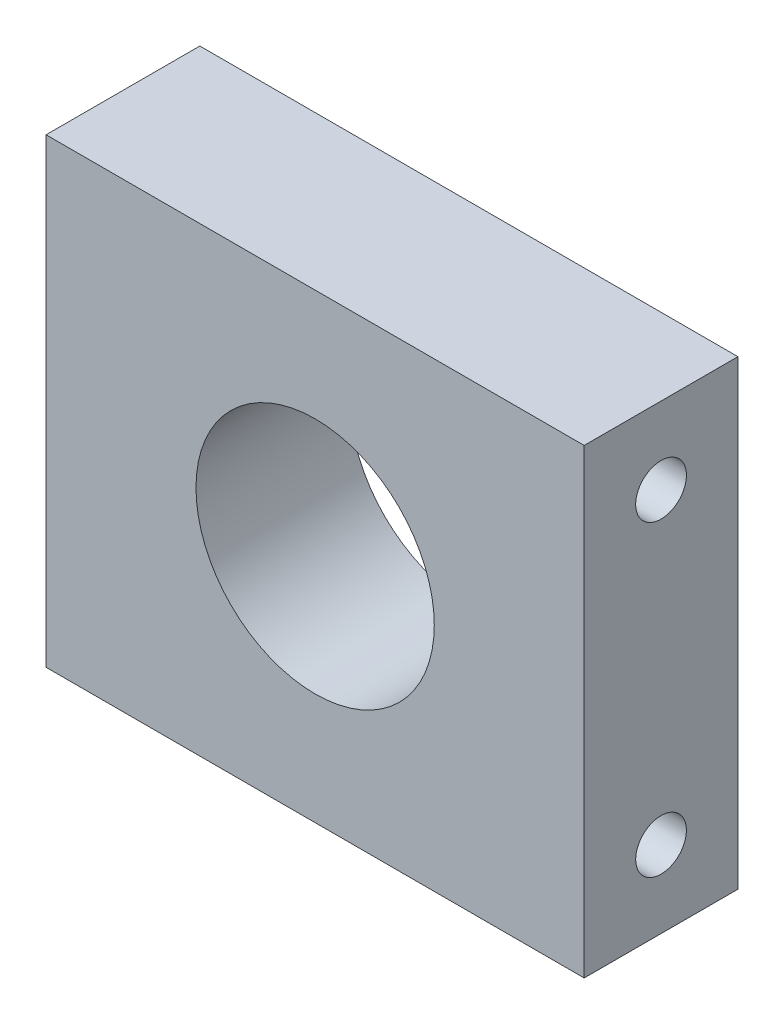
ISO-10303-21;
HEADER;
FILE_DESCRIPTION(('STEP AP214'),'2;1');
FILE_NAME('part.step','',(''),(''),'','','');
FILE_SCHEMA(('AUTOMOTIVE_DESIGN { 1 0 10303 214 1 1 1 1 }'));
ENDSEC;
DATA;
#1=APPLICATION_CONTEXT('core data for automotive mechanical design processes');
#2=APPLICATION_PROTOCOL_DEFINITION('international standard','automotive_design',2000,#1);
#3=PRODUCT_CONTEXT('',#1,'mechanical');
#4=PRODUCT('Part','Part','',(#3));
#5=PRODUCT_RELATED_PRODUCT_CATEGORY('part','',(#4));
#6=PRODUCT_DEFINITION_FORMATION('','',#4);
#7=PRODUCT_DEFINITION_CONTEXT('part definition',#1,'design');
#8=PRODUCT_DEFINITION('design','',#6,#7);
#9=PRODUCT_DEFINITION_SHAPE('','',#8);
#10=(LENGTH_UNIT() NAMED_UNIT(*) SI_UNIT(.MILLI.,.METRE.));
#11=(NAMED_UNIT(*) PLANE_ANGLE_UNIT() SI_UNIT($,.RADIAN.));
#12=(NAMED_UNIT(*) SI_UNIT($,.STERADIAN.) SOLID_ANGLE_UNIT());
#13=UNCERTAINTY_MEASURE_WITH_UNIT(LENGTH_MEASURE(1.E-05),#10,'distance_accuracy_value','');
#14=(GEOMETRIC_REPRESENTATION_CONTEXT(3) GLOBAL_UNCERTAINTY_ASSIGNED_CONTEXT((#13)) GLOBAL_UNIT_ASSIGNED_CONTEXT((#10,
#11,#12)) REPRESENTATION_CONTEXT('',''));
#15=CARTESIAN_POINT('',(0.,0.,0.));
#16=DIRECTION('',(0.,0.,1.));
#17=DIRECTION('',(1.,0.,0.));
#18=AXIS2_PLACEMENT_3D('',#15,#16,#17);
#19=CARTESIAN_POINT('',(-17.5,-15.,10.));
#20=DIRECTION('',(1.,0.,0.));
#21=DIRECTION('',(0.,0.,-1.));
#22=AXIS2_PLACEMENT_3D('',#19,#20,#21);
#23=PLANE('',#22);
#24=CARTESIAN_POINT('',(-17.5,10.,5.));
#25=DIRECTION('',(1.,0.,0.));
#26=DIRECTION('',(0.,0.,-1.));
#27=AXIS2_PLACEMENT_3D('',#24,#25,#26);
#28=CIRCLE('',#27,1.65);
#29=CARTESIAN_POINT('',(-17.5,10.,3.35));
#30=VERTEX_POINT('',#29);
#31=EDGE_CURVE('E128',#30,#30,#28,.T.);
#32=ORIENTED_EDGE('',*,*,#31,.T.);
#33=EDGE_LOOP('',(#32));
#34=FACE_BOUND('',#33,.T.);
#35=DIRECTION('',(0.,-1.,0.));
#36=VECTOR('',#35,1.);
#37=CARTESIAN_POINT('',(-17.5,-15.,0.));
#38=LINE('',#37,#36);
#39=CARTESIAN_POINT('',(-17.5,15.,0.));
#40=VERTEX_POINT('',#39);
#41=CARTESIAN_POINT('',(-17.5,-15.,0.));
#42=VERTEX_POINT('',#41);
#43=EDGE_CURVE('E95',#40,#42,#38,.T.);
#44=ORIENTED_EDGE('',*,*,#43,.T.);
#45=DIRECTION('',(0.,0.,-1.));
#46=VECTOR('',#45,1.);
#47=CARTESIAN_POINT('',(-17.5,-15.,10.));
#48=LINE('',#47,#46);
#49=CARTESIAN_POINT('',(-17.5,-15.,10.));
#50=VERTEX_POINT('',#49);
#51=EDGE_CURVE('E11',#50,#42,#48,.T.);
#52=ORIENTED_EDGE('',*,*,#51,.F.);
#53=DIRECTION('',(0.,-1.,0.));
#54=VECTOR('',#53,1.);
#55=CARTESIAN_POINT('',(-17.5,-15.,10.));
#56=LINE('',#55,#54);
#57=CARTESIAN_POINT('',(-17.5,15.,10.));
#58=VERTEX_POINT('',#57);
#59=EDGE_CURVE('E83',#58,#50,#56,.T.);
#60=ORIENTED_EDGE('',*,*,#59,.F.);
#61=DIRECTION('',(0.,0.,-1.));
#62=VECTOR('',#61,1.);
#63=CARTESIAN_POINT('',(-17.5,15.,10.));
#64=LINE('',#63,#62);
#65=EDGE_CURVE('E91',#58,#40,#64,.T.);
#66=ORIENTED_EDGE('',*,*,#65,.T.);
#67=EDGE_LOOP('',(#44,#52,#60,#66));
#68=FACE_BOUND('',#67,.T.);
#69=CARTESIAN_POINT('',(-17.5,-10.,5.));
#70=DIRECTION('',(1.,0.,0.));
#71=DIRECTION('',(0.,0.,1.));
#72=AXIS2_PLACEMENT_3D('',#69,#70,#71);
#73=CIRCLE('',#72,1.65);
#74=CARTESIAN_POINT('',(-17.5,-10.,6.65));
#75=VERTEX_POINT('',#74);
#76=EDGE_CURVE('E134',#75,#75,#73,.T.);
#77=ORIENTED_EDGE('',*,*,#76,.T.);
#78=EDGE_LOOP('',(#77));
#79=FACE_BOUND('',#78,.T.);
#80=ADVANCED_FACE('F32',(#34,#68,#79),#23,.F.);
#81=CARTESIAN_POINT('',(17.5,-15.,10.));
#82=DIRECTION('',(0.,1.,0.));
#83=DIRECTION('',(-1.,0.,0.));
#84=AXIS2_PLACEMENT_3D('',#81,#82,#83);
#85=PLANE('',#84);
#86=DIRECTION('',(1.,0.,0.));
#87=VECTOR('',#86,1.);
#88=CARTESIAN_POINT('',(17.5,-15.,0.));
#89=LINE('',#88,#87);
#90=CARTESIAN_POINT('',(17.5,-15.,0.));
#91=VERTEX_POINT('',#90);
#92=EDGE_CURVE('E87',#42,#91,#89,.T.);
#93=ORIENTED_EDGE('',*,*,#92,.T.);
#94=DIRECTION('',(0.,0.,-1.));
#95=VECTOR('',#94,1.);
#96=CARTESIAN_POINT('',(17.5,-15.,10.));
#97=LINE('',#96,#95);
#98=CARTESIAN_POINT('',(17.5,-15.,10.));
#99=VERTEX_POINT('',#98);
#100=EDGE_CURVE('E40',#99,#91,#97,.T.);
#101=ORIENTED_EDGE('',*,*,#100,.F.);
#102=DIRECTION('',(1.,0.,0.));
#103=VECTOR('',#102,1.);
#104=CARTESIAN_POINT('',(17.5,-15.,10.));
#105=LINE('',#104,#103);
#106=EDGE_CURVE('E78',#50,#99,#105,.T.);
#107=ORIENTED_EDGE('',*,*,#106,.F.);
#108=ORIENTED_EDGE('',*,*,#51,.T.);
#109=EDGE_LOOP('',(#93,#101,#107,#108));
#110=FACE_BOUND('',#109,.T.);
#111=ADVANCED_FACE('F86',(#110),#85,.F.);
#112=CARTESIAN_POINT('',(17.5,-15.,10.));
#113=DIRECTION('',(-1.,0.,0.));
#114=DIRECTION('',(0.,0.,1.));
#115=AXIS2_PLACEMENT_3D('',#112,#113,#114);
#116=PLANE('',#115);
#117=CARTESIAN_POINT('',(17.5,-10.,5.));
#118=DIRECTION('',(1.,0.,0.));
#119=DIRECTION('',(0.,0.,1.));
#120=AXIS2_PLACEMENT_3D('',#117,#118,#119);
#121=CIRCLE('',#120,1.65);
#122=CARTESIAN_POINT('',(17.5,-10.,6.65));
#123=VERTEX_POINT('',#122);
#124=EDGE_CURVE('E122',#123,#123,#121,.T.);
#125=ORIENTED_EDGE('',*,*,#124,.F.);
#126=EDGE_LOOP('',(#125));
#127=FACE_BOUND('',#126,.T.);
#128=CARTESIAN_POINT('',(17.5,10.,5.));
#129=DIRECTION('',(1.,0.,0.));
#130=DIRECTION('',(0.,0.,-1.));
#131=AXIS2_PLACEMENT_3D('',#128,#129,#130);
#132=CIRCLE('',#131,1.65);
#133=CARTESIAN_POINT('',(17.5,10.,3.35));
#134=VERTEX_POINT('',#133);
#135=EDGE_CURVE('E116',#134,#134,#132,.T.);
#136=ORIENTED_EDGE('',*,*,#135,.F.);
#137=EDGE_LOOP('',(#136));
#138=FACE_BOUND('',#137,.T.);
#139=DIRECTION('',(0.,1.,0.));
#140=VECTOR('',#139,1.);
#141=CARTESIAN_POINT('',(17.5,-15.,0.));
#142=LINE('',#141,#140);
#143=CARTESIAN_POINT('',(17.5,15.,0.));
#144=VERTEX_POINT('',#143);
#145=EDGE_CURVE('E65',#91,#144,#142,.T.);
#146=ORIENTED_EDGE('',*,*,#145,.T.);
#147=DIRECTION('',(0.,0.,-1.));
#148=VECTOR('',#147,1.);
#149=CARTESIAN_POINT('',(17.5,15.,10.));
#150=LINE('',#149,#148);
#151=CARTESIAN_POINT('',(17.5,15.,10.));
#152=VERTEX_POINT('',#151);
#153=EDGE_CURVE('E88',#152,#144,#150,.T.);
#154=ORIENTED_EDGE('',*,*,#153,.F.);
#155=DIRECTION('',(0.,1.,0.));
#156=VECTOR('',#155,1.);
#157=CARTESIAN_POINT('',(17.5,-15.,10.));
#158=LINE('',#157,#156);
#159=EDGE_CURVE('E81',#99,#152,#158,.T.);
#160=ORIENTED_EDGE('',*,*,#159,.F.);
#161=ORIENTED_EDGE('',*,*,#100,.T.);
#162=EDGE_LOOP('',(#146,#154,#160,#161));
#163=FACE_BOUND('',#162,.T.);
#164=ADVANCED_FACE('F89',(#127,#138,#163),#116,.F.);
#165=CARTESIAN_POINT('',(17.5,15.,10.));
#166=DIRECTION('',(0.,-1.,0.));
#167=DIRECTION('',(1.,0.,0.));
#168=AXIS2_PLACEMENT_3D('',#165,#166,#167);
#169=PLANE('',#168);
#170=DIRECTION('',(-1.,0.,0.));
#171=VECTOR('',#170,1.);
#172=CARTESIAN_POINT('',(17.5,15.,0.));
#173=LINE('',#172,#171);
#174=EDGE_CURVE('E71',#144,#40,#173,.T.);
#175=ORIENTED_EDGE('',*,*,#174,.T.);
#176=ORIENTED_EDGE('',*,*,#65,.F.);
#177=DIRECTION('',(-1.,0.,0.));
#178=VECTOR('',#177,1.);
#179=CARTESIAN_POINT('',(17.5,15.,10.));
#180=LINE('',#179,#178);
#181=EDGE_CURVE('E48',#152,#58,#180,.T.);
#182=ORIENTED_EDGE('',*,*,#181,.F.);
#183=ORIENTED_EDGE('',*,*,#153,.T.);
#184=EDGE_LOOP('',(#175,#176,#182,#183));
#185=FACE_BOUND('',#184,.T.);
#186=ADVANCED_FACE('F103',(#185),#169,.F.);
#187=CARTESIAN_POINT('',(-17.5,15.,10.));
#188=DIRECTION('',(0.,0.,1.));
#189=DIRECTION('',(1.,0.,0.));
#190=AXIS2_PLACEMENT_3D('',#187,#188,#189);
#191=PLANE('',#190);
#192=CARTESIAN_POINT('',(0.,0.,10.));
#193=DIRECTION('',(0.,0.,1.));
#194=DIRECTION('',(1.,0.,0.));
#195=AXIS2_PLACEMENT_3D('',#192,#193,#194);
#196=CIRCLE('',#195,7.75);
#197=CARTESIAN_POINT('',(7.75,0.,10.));
#198=VERTEX_POINT('',#197);
#199=EDGE_CURVE('E110',#198,#198,#196,.T.);
#200=ORIENTED_EDGE('',*,*,#199,.F.);
#201=EDGE_LOOP('',(#200));
#202=FACE_BOUND('',#201,.T.);
#203=ORIENTED_EDGE('',*,*,#59,.T.);
#204=ORIENTED_EDGE('',*,*,#106,.T.);
#205=ORIENTED_EDGE('',*,*,#159,.T.);
#206=ORIENTED_EDGE('',*,*,#181,.T.);
#207=EDGE_LOOP('',(#203,#204,#205,#206));
#208=FACE_BOUND('',#207,.T.);
#209=ADVANCED_FACE('F79',(#202,#208),#191,.T.);
#210=CARTESIAN_POINT('',(-17.5,15.,0.));
#211=DIRECTION('',(0.,0.,1.));
#212=DIRECTION('',(1.,0.,0.));
#213=AXIS2_PLACEMENT_3D('',#210,#211,#212);
#214=PLANE('',#213);
#215=CARTESIAN_POINT('',(0.,0.,0.));
#216=DIRECTION('',(0.,0.,1.));
#217=DIRECTION('',(1.,0.,0.));
#218=AXIS2_PLACEMENT_3D('',#215,#216,#217);
#219=CIRCLE('',#218,7.75);
#220=CARTESIAN_POINT('',(7.75,0.,0.));
#221=VERTEX_POINT('',#220);
#222=EDGE_CURVE('E98',#221,#221,#219,.T.);
#223=ORIENTED_EDGE('',*,*,#222,.T.);
#224=EDGE_LOOP('',(#223));
#225=FACE_BOUND('',#224,.T.);
#226=ORIENTED_EDGE('',*,*,#43,.F.);
#227=ORIENTED_EDGE('',*,*,#174,.F.);
#228=ORIENTED_EDGE('',*,*,#145,.F.);
#229=ORIENTED_EDGE('',*,*,#92,.F.);
#230=EDGE_LOOP('',(#226,#227,#228,#229));
#231=FACE_BOUND('',#230,.T.);
#232=ADVANCED_FACE('F106',(#225,#231),#214,.F.);
#233=CARTESIAN_POINT('',(0.,0.,0.));
#234=DIRECTION('',(0.,0.,1.));
#235=DIRECTION('',(1.,0.,0.));
#236=AXIS2_PLACEMENT_3D('',#233,#234,#235);
#237=CYLINDRICAL_SURFACE('',#236,7.75);
#238=ORIENTED_EDGE('',*,*,#222,.F.);
#239=EDGE_LOOP('',(#238));
#240=FACE_BOUND('',#239,.T.);
#241=ORIENTED_EDGE('',*,*,#199,.T.);
#242=EDGE_LOOP('',(#241));
#243=FACE_BOUND('',#242,.T.);
#244=ADVANCED_FACE('F183',(#240,#243),#237,.F.);
#245=CARTESIAN_POINT('',(7.50000000000001,10.,5.));
#246=DIRECTION('',(1.,0.,0.));
#247=DIRECTION('',(0.,0.,-1.));
#248=AXIS2_PLACEMENT_3D('',#245,#246,#247);
#249=CYLINDRICAL_SURFACE('',#248,1.65);
#250=CARTESIAN_POINT('',(7.50000000000001,10.,5.));
#251=DIRECTION('',(1.,0.,0.));
#252=DIRECTION('',(0.,0.,-1.));
#253=AXIS2_PLACEMENT_3D('',#250,#251,#252);
#254=CIRCLE('',#253,1.65);
#255=CARTESIAN_POINT('',(7.50000000000001,10.,3.35));
#256=VERTEX_POINT('',#255);
#257=EDGE_CURVE('E113',#256,#256,#254,.T.);
#258=ORIENTED_EDGE('',*,*,#257,.F.);
#259=EDGE_LOOP('',(#258));
#260=FACE_BOUND('',#259,.T.);
#261=ORIENTED_EDGE('',*,*,#135,.T.);
#262=EDGE_LOOP('',(#261));
#263=FACE_BOUND('',#262,.T.);
#264=ADVANCED_FACE('F179',(#260,#263),#249,.F.);
#265=CARTESIAN_POINT('',(7.50000000000001,10.,5.));
#266=DIRECTION('',(1.,0.,0.));
#267=DIRECTION('',(0.,0.,-1.));
#268=AXIS2_PLACEMENT_3D('',#265,#266,#267);
#269=PLANE('',#268);
#270=ORIENTED_EDGE('',*,*,#257,.T.);
#271=EDGE_LOOP('',(#270));
#272=FACE_BOUND('',#271,.T.);
#273=ADVANCED_FACE('F175',(#272),#269,.T.);
#274=CARTESIAN_POINT('',(7.50000000000001,-10.,5.));
#275=DIRECTION('',(1.,0.,0.));
#276=DIRECTION('',(0.,0.,-1.));
#277=AXIS2_PLACEMENT_3D('',#274,#275,#276);
#278=CYLINDRICAL_SURFACE('',#277,1.65);
#279=CARTESIAN_POINT('',(7.50000000000001,-10.,5.));
#280=DIRECTION('',(1.,0.,0.));
#281=DIRECTION('',(0.,0.,1.));
#282=AXIS2_PLACEMENT_3D('',#279,#280,#281);
#283=CIRCLE('',#282,1.65);
#284=CARTESIAN_POINT('',(7.50000000000001,-10.,6.65));
#285=VERTEX_POINT('',#284);
#286=EDGE_CURVE('E119',#285,#285,#283,.T.);
#287=ORIENTED_EDGE('',*,*,#286,.F.);
#288=EDGE_LOOP('',(#287));
#289=FACE_BOUND('',#288,.T.);
#290=ORIENTED_EDGE('',*,*,#124,.T.);
#291=EDGE_LOOP('',(#290));
#292=FACE_BOUND('',#291,.T.);
#293=ADVANCED_FACE('F169',(#289,#292),#278,.F.);
#294=CARTESIAN_POINT('',(7.50000000000001,-10.,5.));
#295=DIRECTION('',(-1.,0.,0.));
#296=DIRECTION('',(0.,0.,1.));
#297=AXIS2_PLACEMENT_3D('',#294,#295,#296);
#298=PLANE('',#297);
#299=ORIENTED_EDGE('',*,*,#286,.T.);
#300=EDGE_LOOP('',(#299));
#301=FACE_BOUND('',#300,.T.);
#302=ADVANCED_FACE('F160',(#301),#298,.F.);
#303=CARTESIAN_POINT('',(-7.50000000000001,10.,5.));
#304=DIRECTION('',(-1.,0.,0.));
#305=DIRECTION('',(0.,0.,1.));
#306=AXIS2_PLACEMENT_3D('',#303,#304,#305);
#307=CYLINDRICAL_SURFACE('',#306,1.65);
#308=CARTESIAN_POINT('',(-7.50000000000001,10.,5.));
#309=DIRECTION('',(1.,0.,0.));
#310=DIRECTION('',(0.,0.,-1.));
#311=AXIS2_PLACEMENT_3D('',#308,#309,#310);
#312=CIRCLE('',#311,1.65);
#313=CARTESIAN_POINT('',(-7.50000000000001,10.,3.35));
#314=VERTEX_POINT('',#313);
#315=EDGE_CURVE('E125',#314,#314,#312,.T.);
#316=ORIENTED_EDGE('',*,*,#315,.T.);
#317=EDGE_LOOP('',(#316));
#318=FACE_BOUND('',#317,.T.);
#319=ORIENTED_EDGE('',*,*,#31,.F.);
#320=EDGE_LOOP('',(#319));
#321=FACE_BOUND('',#320,.T.);
#322=ADVANCED_FACE('F158',(#318,#321),#307,.F.);
#323=CARTESIAN_POINT('',(-7.50000000000001,10.,5.));
#324=DIRECTION('',(-1.,0.,0.));
#325=DIRECTION('',(0.,0.,-1.));
#326=AXIS2_PLACEMENT_3D('',#323,#324,#325);
#327=PLANE('',#326);
#328=ORIENTED_EDGE('',*,*,#315,.F.);
#329=EDGE_LOOP('',(#328));
#330=FACE_BOUND('',#329,.T.);
#331=ADVANCED_FACE('F149',(#330),#327,.T.);
#332=CARTESIAN_POINT('',(-7.50000000000001,-10.,5.));
#333=DIRECTION('',(-1.,0.,0.));
#334=DIRECTION('',(0.,0.,1.));
#335=AXIS2_PLACEMENT_3D('',#332,#333,#334);
#336=CYLINDRICAL_SURFACE('',#335,1.65);
#337=CARTESIAN_POINT('',(-7.50000000000001,-10.,5.));
#338=DIRECTION('',(1.,0.,0.));
#339=DIRECTION('',(0.,0.,1.));
#340=AXIS2_PLACEMENT_3D('',#337,#338,#339);
#341=CIRCLE('',#340,1.65);
#342=CARTESIAN_POINT('',(-7.50000000000001,-10.,6.65));
#343=VERTEX_POINT('',#342);
#344=EDGE_CURVE('E131',#343,#343,#341,.T.);
#345=ORIENTED_EDGE('',*,*,#344,.T.);
#346=EDGE_LOOP('',(#345));
#347=FACE_BOUND('',#346,.T.);
#348=ORIENTED_EDGE('',*,*,#76,.F.);
#349=EDGE_LOOP('',(#348));
#350=FACE_BOUND('',#349,.T.);
#351=ADVANCED_FACE('F140',(#347,#350),#336,.F.);
#352=CARTESIAN_POINT('',(-7.50000000000001,-10.,5.));
#353=DIRECTION('',(1.,0.,0.));
#354=DIRECTION('',(0.,0.,1.));
#355=AXIS2_PLACEMENT_3D('',#352,#353,#354);
#356=PLANE('',#355);
#357=ORIENTED_EDGE('',*,*,#344,.F.);
#358=EDGE_LOOP('',(#357));
#359=FACE_BOUND('',#358,.T.);
#360=ADVANCED_FACE('F143',(#359),#356,.F.);
#361=CLOSED_SHELL('',(#80,#111,#164,#186,#209,#232,#244,#264,#273,#293,#302,#322,#331,#351,#360));
#362=MANIFOLD_SOLID_BREP('B2',#361);
#363=ADVANCED_BREP_SHAPE_REPRESENTATION('',(#18,#362),#14);
#364=SHAPE_DEFINITION_REPRESENTATION(#9,#363);
ENDSEC;
END-ISO-10303-21;
